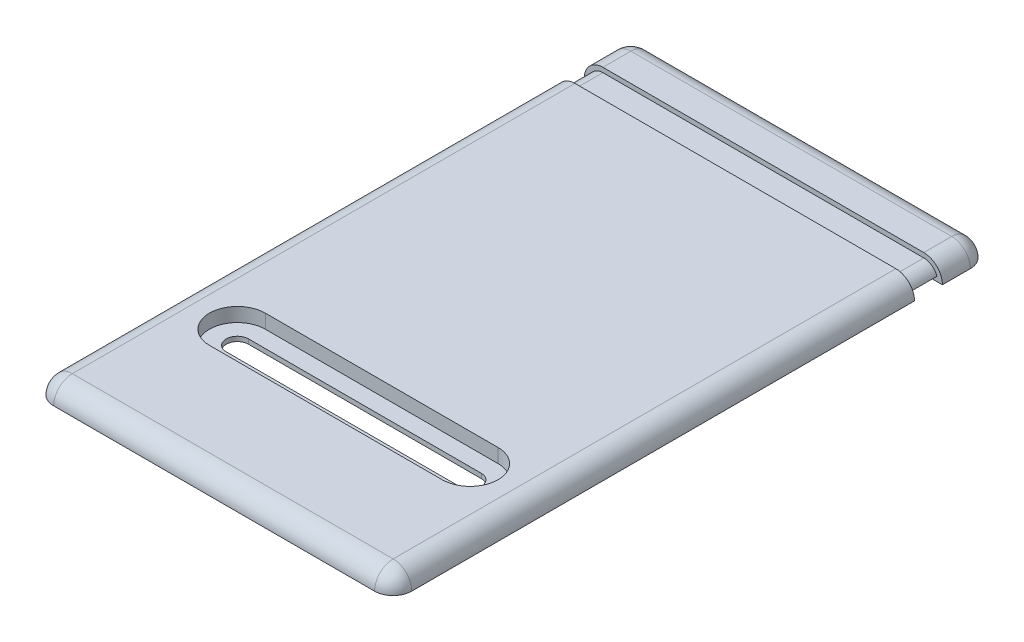
ISO-10303-21;
HEADER;
FILE_DESCRIPTION(('STEP AP214'),'2;1');
FILE_NAME('part.step','',(''),(''),'','','');
FILE_SCHEMA(('AUTOMOTIVE_DESIGN { 1 0 10303 214 1 1 1 1 }'));
ENDSEC;
DATA;
#1=APPLICATION_CONTEXT('core data for automotive mechanical design processes');
#2=APPLICATION_PROTOCOL_DEFINITION('international standard','automotive_design',2000,#1);
#3=PRODUCT_CONTEXT('',#1,'mechanical');
#4=PRODUCT('Part','Part','',(#3));
#5=PRODUCT_RELATED_PRODUCT_CATEGORY('part','',(#4));
#6=PRODUCT_DEFINITION_FORMATION('','',#4);
#7=PRODUCT_DEFINITION_CONTEXT('part definition',#1,'design');
#8=PRODUCT_DEFINITION('design','',#6,#7);
#9=PRODUCT_DEFINITION_SHAPE('','',#8);
#10=(LENGTH_UNIT() NAMED_UNIT(*) SI_UNIT(.MILLI.,.METRE.));
#11=(NAMED_UNIT(*) PLANE_ANGLE_UNIT() SI_UNIT($,.RADIAN.));
#12=(NAMED_UNIT(*) SI_UNIT($,.STERADIAN.) SOLID_ANGLE_UNIT());
#13=UNCERTAINTY_MEASURE_WITH_UNIT(LENGTH_MEASURE(1.E-05),#10,'distance_accuracy_value','');
#14=(GEOMETRIC_REPRESENTATION_CONTEXT(3) GLOBAL_UNCERTAINTY_ASSIGNED_CONTEXT((#13)) GLOBAL_UNIT_ASSIGNED_CONTEXT((#10,
#11,#12)) REPRESENTATION_CONTEXT('',''));
#15=CARTESIAN_POINT('',(0.,0.,0.));
#16=DIRECTION('',(0.,0.,1.));
#17=DIRECTION('',(1.,0.,0.));
#18=AXIS2_PLACEMENT_3D('',#15,#16,#17);
#19=CARTESIAN_POINT('',(0.,2.,0.));
#20=DIRECTION('',(0.,-1.,0.));
#21=DIRECTION('',(0.,0.,-1.));
#22=AXIS2_PLACEMENT_3D('',#19,#20,#21);
#23=PLANE('',#22);
#24=DIRECTION('',(1.,0.,0.));
#25=VECTOR('',#24,1.);
#26=CARTESIAN_POINT('',(-12.5,2.,20.));
#27=LINE('',#26,#25);
#28=CARTESIAN_POINT('',(-12.5,2.,20.));
#29=VERTEX_POINT('',#28);
#30=CARTESIAN_POINT('',(12.5,2.,20.));
#31=VERTEX_POINT('',#30);
#32=EDGE_CURVE('E291',#29,#31,#27,.T.);
#33=ORIENTED_EDGE('',*,*,#32,.F.);
#34=CARTESIAN_POINT('',(-12.5,2.,17.));
#35=DIRECTION('',(0.,1.,0.));
#36=DIRECTION('',(0.,0.,1.));
#37=AXIS2_PLACEMENT_3D('',#34,#35,#36);
#38=CIRCLE('',#37,3.);
#39=CARTESIAN_POINT('',(-12.5,2.,14.));
#40=VERTEX_POINT('',#39);
#41=EDGE_CURVE('E270',#40,#29,#38,.T.);
#42=ORIENTED_EDGE('',*,*,#41,.F.);
#43=DIRECTION('',(1.,0.,0.));
#44=VECTOR('',#43,1.);
#45=CARTESIAN_POINT('',(-12.5,2.,14.));
#46=LINE('',#45,#44);
#47=CARTESIAN_POINT('',(12.5,2.,14.));
#48=VERTEX_POINT('',#47);
#49=EDGE_CURVE('E281',#40,#48,#46,.T.);
#50=ORIENTED_EDGE('',*,*,#49,.T.);
#51=CARTESIAN_POINT('',(12.5,2.,17.));
#52=DIRECTION('',(0.,1.,0.));
#53=DIRECTION('',(0.,0.,1.));
#54=AXIS2_PLACEMENT_3D('',#51,#52,#53);
#55=CIRCLE('',#54,3.);
#56=EDGE_CURVE('E294',#31,#48,#55,.T.);
#57=ORIENTED_EDGE('',*,*,#56,.F.);
#58=EDGE_LOOP('',(#33,#42,#50,#57));
#59=FACE_BOUND('',#58,.T.);
#60=DIRECTION('',(0.,0.,-1.));
#61=VECTOR('',#60,1.);
#62=CARTESIAN_POINT('',(17.235,2.,0.));
#63=LINE('',#62,#61);
#64=CARTESIAN_POINT('',(17.235,2.,30.));
#65=VERTEX_POINT('',#64);
#66=CARTESIAN_POINT('',(17.235,2.,-24.));
#67=VERTEX_POINT('',#66);
#68=EDGE_CURVE('E329',#65,#67,#63,.T.);
#69=ORIENTED_EDGE('',*,*,#68,.T.);
#70=DIRECTION('',(-1.,0.,0.));
#71=VECTOR('',#70,1.);
#72=CARTESIAN_POINT('',(-17.235,2.,-24.));
#73=LINE('',#72,#71);
#74=CARTESIAN_POINT('',(-17.235,2.,-24.));
#75=VERTEX_POINT('',#74);
#76=EDGE_CURVE('E52',#67,#75,#73,.T.);
#77=ORIENTED_EDGE('',*,*,#76,.T.);
#78=DIRECTION('',(0.,0.,-1.));
#79=VECTOR('',#78,1.);
#80=CARTESIAN_POINT('',(-17.235,2.,32.));
#81=LINE('',#80,#79);
#82=CARTESIAN_POINT('',(-17.235,2.,30.));
#83=VERTEX_POINT('',#82);
#84=EDGE_CURVE('E322',#75,#83,#81,.F.);
#85=ORIENTED_EDGE('',*,*,#84,.T.);
#86=DIRECTION('',(1.,0.,0.));
#87=VECTOR('',#86,1.);
#88=CARTESIAN_POINT('',(0.,2.,30.));
#89=LINE('',#88,#87);
#90=EDGE_CURVE('E326',#83,#65,#89,.T.);
#91=ORIENTED_EDGE('',*,*,#90,.T.);
#92=EDGE_LOOP('',(#69,#77,#85,#91));
#93=FACE_BOUND('',#92,.T.);
#94=ADVANCED_FACE('F35',(#59,#93),#23,.F.);
#95=CARTESIAN_POINT('',(0.,0.,0.));
#96=DIRECTION('',(0.,-1.,0.));
#97=DIRECTION('',(0.,0.,-1.));
#98=AXIS2_PLACEMENT_3D('',#95,#96,#97);
#99=PLANE('',#98);
#100=DIRECTION('',(1.,0.,0.));
#101=VECTOR('',#100,1.);
#102=CARTESIAN_POINT('',(-19.235,0.,-24.));
#103=LINE('',#102,#101);
#104=CARTESIAN_POINT('',(-19.235,0.,-24.));
#105=VERTEX_POINT('',#104);
#106=CARTESIAN_POINT('',(19.235,0.,-24.));
#107=VERTEX_POINT('',#106);
#108=EDGE_CURVE('E232',#105,#107,#103,.T.);
#109=ORIENTED_EDGE('',*,*,#108,.T.);
#110=DIRECTION('',(0.,0.,-1.));
#111=VECTOR('',#110,1.);
#112=CARTESIAN_POINT('',(19.235,0.,32.));
#113=LINE('',#112,#111);
#114=CARTESIAN_POINT('',(19.235,0.,30.));
#115=VERTEX_POINT('',#114);
#116=EDGE_CURVE('E316',#115,#107,#113,.T.);
#117=ORIENTED_EDGE('',*,*,#116,.F.);
#118=CARTESIAN_POINT('',(17.235,0.,30.));
#119=DIRECTION('',(0.,-1.,0.));
#120=DIRECTION('',(0.,0.,-1.));
#121=AXIS2_PLACEMENT_3D('',#118,#119,#120);
#122=CIRCLE('',#121,2.);
#123=CARTESIAN_POINT('',(17.235,0.,32.));
#124=VERTEX_POINT('',#123);
#125=EDGE_CURVE('E335',#115,#124,#122,.T.);
#126=ORIENTED_EDGE('',*,*,#125,.T.);
#127=DIRECTION('',(1.,0.,0.));
#128=VECTOR('',#127,1.);
#129=CARTESIAN_POINT('',(-19.235,0.,32.));
#130=LINE('',#129,#128);
#131=CARTESIAN_POINT('',(-17.235,0.,32.));
#132=VERTEX_POINT('',#131);
#133=EDGE_CURVE('E319',#132,#124,#130,.T.);
#134=ORIENTED_EDGE('',*,*,#133,.F.);
#135=CARTESIAN_POINT('',(-17.235,0.,30.));
#136=DIRECTION('',(0.,-1.,0.));
#137=DIRECTION('',(0.,0.,-1.));
#138=AXIS2_PLACEMENT_3D('',#135,#136,#137);
#139=CIRCLE('',#138,2.);
#140=CARTESIAN_POINT('',(-19.235,0.,30.));
#141=VERTEX_POINT('',#140);
#142=EDGE_CURVE('E337',#132,#141,#139,.T.);
#143=ORIENTED_EDGE('',*,*,#142,.T.);
#144=DIRECTION('',(0.,0.,-1.));
#145=VECTOR('',#144,1.);
#146=CARTESIAN_POINT('',(-19.235,0.,32.));
#147=LINE('',#146,#145);
#148=EDGE_CURVE('E308',#141,#105,#147,.T.);
#149=ORIENTED_EDGE('',*,*,#148,.T.);
#150=EDGE_LOOP('',(#109,#117,#126,#134,#143,#149));
#151=FACE_BOUND('',#150,.T.);
#152=CARTESIAN_POINT('',(12.5,0.,17.));
#153=DIRECTION('',(0.,1.,0.));
#154=DIRECTION('',(0.,0.,1.));
#155=AXIS2_PLACEMENT_3D('',#152,#153,#154);
#156=CIRCLE('',#155,1.2);
#157=CARTESIAN_POINT('',(12.5,0.,18.2));
#158=VERTEX_POINT('',#157);
#159=CARTESIAN_POINT('',(12.5,0.,15.8));
#160=VERTEX_POINT('',#159);
#161=EDGE_CURVE('E245',#158,#160,#156,.T.);
#162=ORIENTED_EDGE('',*,*,#161,.T.);
#163=DIRECTION('',(-1.,0.,0.));
#164=VECTOR('',#163,1.);
#165=CARTESIAN_POINT('',(12.5,0.,15.8));
#166=LINE('',#165,#164);
#167=CARTESIAN_POINT('',(-12.5,0.,15.8));
#168=VERTEX_POINT('',#167);
#169=EDGE_CURVE('E248',#160,#168,#166,.T.);
#170=ORIENTED_EDGE('',*,*,#169,.T.);
#171=CARTESIAN_POINT('',(-12.5,0.,17.));
#172=DIRECTION('',(0.,1.,0.));
#173=DIRECTION('',(0.,0.,1.));
#174=AXIS2_PLACEMENT_3D('',#171,#172,#173);
#175=CIRCLE('',#174,1.2);
#176=CARTESIAN_POINT('',(-12.5,0.,18.2));
#177=VERTEX_POINT('',#176);
#178=EDGE_CURVE('E252',#168,#177,#175,.T.);
#179=ORIENTED_EDGE('',*,*,#178,.T.);
#180=DIRECTION('',(1.,0.,0.));
#181=VECTOR('',#180,1.);
#182=CARTESIAN_POINT('',(-12.5,0.,18.2));
#183=LINE('',#182,#181);
#184=EDGE_CURVE('E255',#177,#158,#183,.T.);
#185=ORIENTED_EDGE('',*,*,#184,.T.);
#186=EDGE_LOOP('',(#162,#170,#179,#185));
#187=FACE_BOUND('',#186,.T.);
#188=ADVANCED_FACE('F412',(#151,#187),#99,.T.);
#189=CARTESIAN_POINT('',(0.,0.,30.));
#190=DIRECTION('',(1.,0.,0.));
#191=DIRECTION('',(0.,0.,-1.));
#192=AXIS2_PLACEMENT_3D('',#189,#190,#191);
#193=CYLINDRICAL_SURFACE('',#192,2.);
#194=CARTESIAN_POINT('',(-17.235,0.,30.));
#195=DIRECTION('',(-1.,0.,0.));
#196=DIRECTION('',(0.,0.,1.));
#197=AXIS2_PLACEMENT_3D('',#194,#195,#196);
#198=CIRCLE('',#197,2.);
#199=EDGE_CURVE('E39',#132,#83,#198,.T.);
#200=ORIENTED_EDGE('',*,*,#199,.F.);
#201=ORIENTED_EDGE('',*,*,#133,.T.);
#202=CARTESIAN_POINT('',(17.235,0.,30.));
#203=DIRECTION('',(1.,0.,0.));
#204=DIRECTION('',(0.,0.,-1.));
#205=AXIS2_PLACEMENT_3D('',#202,#203,#204);
#206=CIRCLE('',#205,2.);
#207=EDGE_CURVE('E354',#65,#124,#206,.T.);
#208=ORIENTED_EDGE('',*,*,#207,.F.);
#209=ORIENTED_EDGE('',*,*,#90,.F.);
#210=EDGE_LOOP('',(#200,#201,#208,#209));
#211=FACE_BOUND('',#210,.T.);
#212=ADVANCED_FACE('F37',(#211),#193,.T.);
#213=CARTESIAN_POINT('',(-17.235,0.,30.));
#214=DIRECTION('',(0.,0.,1.));
#215=DIRECTION('',(1.,0.,0.));
#216=AXIS2_PLACEMENT_3D('',#213,#214,#215);
#217=SPHERICAL_SURFACE('',#216,2.);
#218=ORIENTED_EDGE('',*,*,#142,.F.);
#219=ORIENTED_EDGE('',*,*,#199,.T.);
#220=CARTESIAN_POINT('',(-17.235,0.,30.));
#221=DIRECTION('',(0.,0.,1.));
#222=DIRECTION('',(1.,0.,0.));
#223=AXIS2_PLACEMENT_3D('',#220,#221,#222);
#224=CIRCLE('',#223,2.);
#225=EDGE_CURVE('E352',#141,#83,#224,.F.);
#226=ORIENTED_EDGE('',*,*,#225,.F.);
#227=EDGE_LOOP('',(#218,#219,#226));
#228=FACE_BOUND('',#227,.T.);
#229=ADVANCED_FACE('F448',(#228),#217,.T.);
#230=CARTESIAN_POINT('',(17.235,0.,30.));
#231=DIRECTION('',(0.,0.,1.));
#232=DIRECTION('',(1.,0.,0.));
#233=AXIS2_PLACEMENT_3D('',#230,#231,#232);
#234=SPHERICAL_SURFACE('',#233,2.);
#235=ORIENTED_EDGE('',*,*,#207,.T.);
#236=ORIENTED_EDGE('',*,*,#125,.F.);
#237=CARTESIAN_POINT('',(17.235,0.,30.));
#238=DIRECTION('',(0.,0.,1.));
#239=DIRECTION('',(1.,0.,0.));
#240=AXIS2_PLACEMENT_3D('',#237,#238,#239);
#241=CIRCLE('',#240,2.);
#242=EDGE_CURVE('E349',#65,#115,#241,.F.);
#243=ORIENTED_EDGE('',*,*,#242,.F.);
#244=EDGE_LOOP('',(#235,#236,#243));
#245=FACE_BOUND('',#244,.T.);
#246=ADVANCED_FACE('F445',(#245),#234,.T.);
#247=CARTESIAN_POINT('',(-17.235,0.,32.));
#248=DIRECTION('',(0.,0.,1.));
#249=DIRECTION('',(1.,0.,0.));
#250=AXIS2_PLACEMENT_3D('',#247,#248,#249);
#251=CYLINDRICAL_SURFACE('',#250,2.);
#252=CARTESIAN_POINT('',(-17.235,0.,-24.));
#253=DIRECTION('',(0.,0.,1.));
#254=DIRECTION('',(1.,0.,0.));
#255=AXIS2_PLACEMENT_3D('',#252,#253,#254);
#256=CIRCLE('',#255,2.);
#257=EDGE_CURVE('E229',#75,#105,#256,.T.);
#258=ORIENTED_EDGE('',*,*,#257,.T.);
#259=ORIENTED_EDGE('',*,*,#148,.F.);
#260=ORIENTED_EDGE('',*,*,#225,.T.);
#261=ORIENTED_EDGE('',*,*,#84,.F.);
#262=EDGE_LOOP('',(#258,#259,#260,#261));
#263=FACE_BOUND('',#262,.T.);
#264=ADVANCED_FACE('F441',(#263),#251,.T.);
#265=CARTESIAN_POINT('',(17.235,0.,0.));
#266=DIRECTION('',(0.,0.,-1.));
#267=DIRECTION('',(-1.,0.,0.));
#268=AXIS2_PLACEMENT_3D('',#265,#266,#267);
#269=CYLINDRICAL_SURFACE('',#268,2.);
#270=CARTESIAN_POINT('',(17.235,0.,-24.));
#271=DIRECTION('',(0.,0.,1.));
#272=DIRECTION('',(1.,0.,0.));
#273=AXIS2_PLACEMENT_3D('',#270,#271,#272);
#274=CIRCLE('',#273,2.);
#275=EDGE_CURVE('E236',#107,#67,#274,.T.);
#276=ORIENTED_EDGE('',*,*,#275,.T.);
#277=ORIENTED_EDGE('',*,*,#68,.F.);
#278=ORIENTED_EDGE('',*,*,#242,.T.);
#279=ORIENTED_EDGE('',*,*,#116,.T.);
#280=EDGE_LOOP('',(#276,#277,#278,#279));
#281=FACE_BOUND('',#280,.T.);
#282=ADVANCED_FACE('F431',(#281),#269,.T.);
#283=CARTESIAN_POINT('',(-12.5,0.5,17.));
#284=DIRECTION('',(0.,1.,0.));
#285=DIRECTION('',(0.,0.,1.));
#286=AXIS2_PLACEMENT_3D('',#283,#284,#285);
#287=CYLINDRICAL_SURFACE('',#286,3.);
#288=ORIENTED_EDGE('',*,*,#41,.T.);
#289=DIRECTION('',(0.,1.,0.));
#290=VECTOR('',#289,1.);
#291=CARTESIAN_POINT('',(-12.5,0.5,20.));
#292=LINE('',#291,#290);
#293=CARTESIAN_POINT('',(-12.5,0.5,20.));
#294=VERTEX_POINT('',#293);
#295=EDGE_CURVE('E289',#294,#29,#292,.T.);
#296=ORIENTED_EDGE('',*,*,#295,.F.);
#297=CARTESIAN_POINT('',(-12.5,0.5,17.));
#298=DIRECTION('',(0.,1.,0.));
#299=DIRECTION('',(0.,0.,1.));
#300=AXIS2_PLACEMENT_3D('',#297,#298,#299);
#301=CIRCLE('',#300,3.);
#302=CARTESIAN_POINT('',(-12.5,0.5,14.));
#303=VERTEX_POINT('',#302);
#304=EDGE_CURVE('E277',#303,#294,#301,.T.);
#305=ORIENTED_EDGE('',*,*,#304,.F.);
#306=DIRECTION('',(0.,1.,0.));
#307=VECTOR('',#306,1.);
#308=CARTESIAN_POINT('',(-12.5,0.5,14.));
#309=LINE('',#308,#307);
#310=EDGE_CURVE('E299',#303,#40,#309,.T.);
#311=ORIENTED_EDGE('',*,*,#310,.T.);
#312=EDGE_LOOP('',(#288,#296,#305,#311));
#313=FACE_BOUND('',#312,.T.);
#314=ADVANCED_FACE('F440',(#313),#287,.F.);
#315=CARTESIAN_POINT('',(-12.5,0.5,14.));
#316=DIRECTION('',(0.,0.,1.));
#317=DIRECTION('',(1.,0.,0.));
#318=AXIS2_PLACEMENT_3D('',#315,#316,#317);
#319=PLANE('',#318);
#320=ORIENTED_EDGE('',*,*,#49,.F.);
#321=ORIENTED_EDGE('',*,*,#310,.F.);
#322=DIRECTION('',(1.,0.,0.));
#323=VECTOR('',#322,1.);
#324=CARTESIAN_POINT('',(-12.5,0.5,14.));
#325=LINE('',#324,#323);
#326=CARTESIAN_POINT('',(12.5,0.5,14.));
#327=VERTEX_POINT('',#326);
#328=EDGE_CURVE('E287',#303,#327,#325,.T.);
#329=ORIENTED_EDGE('',*,*,#328,.T.);
#330=DIRECTION('',(0.,1.,0.));
#331=VECTOR('',#330,1.);
#332=CARTESIAN_POINT('',(12.5,0.5,14.));
#333=LINE('',#332,#331);
#334=EDGE_CURVE('E302',#327,#48,#333,.T.);
#335=ORIENTED_EDGE('',*,*,#334,.T.);
#336=EDGE_LOOP('',(#320,#321,#329,#335));
#337=FACE_BOUND('',#336,.T.);
#338=ADVANCED_FACE('F486',(#337),#319,.T.);
#339=CARTESIAN_POINT('',(12.5,0.5,17.));
#340=DIRECTION('',(0.,1.,0.));
#341=DIRECTION('',(0.,0.,1.));
#342=AXIS2_PLACEMENT_3D('',#339,#340,#341);
#343=CYLINDRICAL_SURFACE('',#342,3.);
#344=ORIENTED_EDGE('',*,*,#56,.T.);
#345=ORIENTED_EDGE('',*,*,#334,.F.);
#346=CARTESIAN_POINT('',(12.5,0.5,17.));
#347=DIRECTION('',(0.,1.,0.));
#348=DIRECTION('',(0.,0.,1.));
#349=AXIS2_PLACEMENT_3D('',#346,#347,#348);
#350=CIRCLE('',#349,3.);
#351=CARTESIAN_POINT('',(12.5,0.5,20.));
#352=VERTEX_POINT('',#351);
#353=EDGE_CURVE('E284',#352,#327,#350,.T.);
#354=ORIENTED_EDGE('',*,*,#353,.F.);
#355=DIRECTION('',(0.,1.,0.));
#356=VECTOR('',#355,1.);
#357=CARTESIAN_POINT('',(12.5,0.5,20.));
#358=LINE('',#357,#356);
#359=EDGE_CURVE('E304',#352,#31,#358,.T.);
#360=ORIENTED_EDGE('',*,*,#359,.T.);
#361=EDGE_LOOP('',(#344,#345,#354,#360));
#362=FACE_BOUND('',#361,.T.);
#363=ADVANCED_FACE('F489',(#362),#343,.F.);
#364=CARTESIAN_POINT('',(-12.5,0.5,20.));
#365=DIRECTION('',(0.,0.,1.));
#366=DIRECTION('',(1.,0.,0.));
#367=AXIS2_PLACEMENT_3D('',#364,#365,#366);
#368=PLANE('',#367);
#369=ORIENTED_EDGE('',*,*,#32,.T.);
#370=ORIENTED_EDGE('',*,*,#359,.F.);
#371=DIRECTION('',(1.,0.,0.));
#372=VECTOR('',#371,1.);
#373=CARTESIAN_POINT('',(-12.5,0.5,20.));
#374=LINE('',#373,#372);
#375=EDGE_CURVE('E280',#294,#352,#374,.T.);
#376=ORIENTED_EDGE('',*,*,#375,.F.);
#377=ORIENTED_EDGE('',*,*,#295,.T.);
#378=EDGE_LOOP('',(#369,#370,#376,#377));
#379=FACE_BOUND('',#378,.T.);
#380=ADVANCED_FACE('F484',(#379),#368,.F.);
#381=CARTESIAN_POINT('',(-12.5,0.5,17.));
#382=DIRECTION('',(0.,1.,0.));
#383=DIRECTION('',(0.,0.,1.));
#384=AXIS2_PLACEMENT_3D('',#381,#382,#383);
#385=PLANE('',#384);
#386=CARTESIAN_POINT('',(12.5,0.5,17.));
#387=DIRECTION('',(0.,1.,0.));
#388=DIRECTION('',(0.,0.,1.));
#389=AXIS2_PLACEMENT_3D('',#386,#387,#388);
#390=CIRCLE('',#389,1.2);
#391=CARTESIAN_POINT('',(12.5,0.5,18.2));
#392=VERTEX_POINT('',#391);
#393=CARTESIAN_POINT('',(12.5,0.5,15.8));
#394=VERTEX_POINT('',#393);
#395=EDGE_CURVE('E239',#392,#394,#390,.T.);
#396=ORIENTED_EDGE('',*,*,#395,.F.);
#397=DIRECTION('',(1.,0.,0.));
#398=VECTOR('',#397,1.);
#399=CARTESIAN_POINT('',(-12.5,0.5,18.2));
#400=LINE('',#399,#398);
#401=CARTESIAN_POINT('',(-12.5,0.5,18.2));
#402=VERTEX_POINT('',#401);
#403=EDGE_CURVE('E249',#402,#392,#400,.T.);
#404=ORIENTED_EDGE('',*,*,#403,.F.);
#405=CARTESIAN_POINT('',(-12.5,0.5,17.));
#406=DIRECTION('',(0.,1.,0.));
#407=DIRECTION('',(0.,0.,1.));
#408=AXIS2_PLACEMENT_3D('',#405,#406,#407);
#409=CIRCLE('',#408,1.2);
#410=CARTESIAN_POINT('',(-12.5,0.5,15.8));
#411=VERTEX_POINT('',#410);
#412=EDGE_CURVE('E263',#411,#402,#409,.T.);
#413=ORIENTED_EDGE('',*,*,#412,.F.);
#414=DIRECTION('',(-1.,0.,0.));
#415=VECTOR('',#414,1.);
#416=CARTESIAN_POINT('',(12.5,0.5,15.8));
#417=LINE('',#416,#415);
#418=EDGE_CURVE('E260',#394,#411,#417,.T.);
#419=ORIENTED_EDGE('',*,*,#418,.F.);
#420=EDGE_LOOP('',(#396,#404,#413,#419));
#421=FACE_BOUND('',#420,.T.);
#422=ORIENTED_EDGE('',*,*,#304,.T.);
#423=ORIENTED_EDGE('',*,*,#375,.T.);
#424=ORIENTED_EDGE('',*,*,#353,.T.);
#425=ORIENTED_EDGE('',*,*,#328,.F.);
#426=EDGE_LOOP('',(#422,#423,#424,#425));
#427=FACE_BOUND('',#426,.T.);
#428=ADVANCED_FACE('F480',(#421,#427),#385,.T.);
#429=CARTESIAN_POINT('',(12.5,0.,17.));
#430=DIRECTION('',(0.,1.,0.));
#431=DIRECTION('',(0.,0.,1.));
#432=AXIS2_PLACEMENT_3D('',#429,#430,#431);
#433=CYLINDRICAL_SURFACE('',#432,1.2);
#434=ORIENTED_EDGE('',*,*,#395,.T.);
#435=DIRECTION('',(0.,1.,0.));
#436=VECTOR('',#435,1.);
#437=CARTESIAN_POINT('',(12.5,0.,15.8));
#438=LINE('',#437,#436);
#439=EDGE_CURVE('E258',#160,#394,#438,.T.);
#440=ORIENTED_EDGE('',*,*,#439,.F.);
#441=ORIENTED_EDGE('',*,*,#161,.F.);
#442=DIRECTION('',(0.,1.,0.));
#443=VECTOR('',#442,1.);
#444=CARTESIAN_POINT('',(12.5,0.,18.2));
#445=LINE('',#444,#443);
#446=EDGE_CURVE('E268',#158,#392,#445,.T.);
#447=ORIENTED_EDGE('',*,*,#446,.T.);
#448=EDGE_LOOP('',(#434,#440,#441,#447));
#449=FACE_BOUND('',#448,.T.);
#450=ADVANCED_FACE('F473',(#449),#433,.F.);
#451=CARTESIAN_POINT('',(-12.5,0.,18.2));
#452=DIRECTION('',(0.,0.,1.));
#453=DIRECTION('',(1.,0.,0.));
#454=AXIS2_PLACEMENT_3D('',#451,#452,#453);
#455=PLANE('',#454);
#456=ORIENTED_EDGE('',*,*,#403,.T.);
#457=ORIENTED_EDGE('',*,*,#446,.F.);
#458=ORIENTED_EDGE('',*,*,#184,.F.);
#459=DIRECTION('',(0.,1.,0.));
#460=VECTOR('',#459,1.);
#461=CARTESIAN_POINT('',(-12.5,0.,18.2));
#462=LINE('',#461,#460);
#463=EDGE_CURVE('E271',#177,#402,#462,.T.);
#464=ORIENTED_EDGE('',*,*,#463,.T.);
#465=EDGE_LOOP('',(#456,#457,#458,#464));
#466=FACE_BOUND('',#465,.T.);
#467=ADVANCED_FACE('F470',(#466),#455,.F.);
#468=CARTESIAN_POINT('',(-12.5,0.,17.));
#469=DIRECTION('',(0.,1.,0.));
#470=DIRECTION('',(0.,0.,1.));
#471=AXIS2_PLACEMENT_3D('',#468,#469,#470);
#472=CYLINDRICAL_SURFACE('',#471,1.2);
#473=ORIENTED_EDGE('',*,*,#412,.T.);
#474=ORIENTED_EDGE('',*,*,#463,.F.);
#475=ORIENTED_EDGE('',*,*,#178,.F.);
#476=DIRECTION('',(0.,1.,0.));
#477=VECTOR('',#476,1.);
#478=CARTESIAN_POINT('',(-12.5,0.,15.8));
#479=LINE('',#478,#477);
#480=EDGE_CURVE('E273',#168,#411,#479,.T.);
#481=ORIENTED_EDGE('',*,*,#480,.T.);
#482=EDGE_LOOP('',(#473,#474,#475,#481));
#483=FACE_BOUND('',#482,.T.);
#484=ADVANCED_FACE('F465',(#483),#472,.F.);
#485=CARTESIAN_POINT('',(12.5,0.,15.8));
#486=DIRECTION('',(0.,0.,-1.));
#487=DIRECTION('',(-1.,0.,0.));
#488=AXIS2_PLACEMENT_3D('',#485,#486,#487);
#489=PLANE('',#488);
#490=ORIENTED_EDGE('',*,*,#418,.T.);
#491=ORIENTED_EDGE('',*,*,#480,.F.);
#492=ORIENTED_EDGE('',*,*,#169,.F.);
#493=ORIENTED_EDGE('',*,*,#439,.T.);
#494=EDGE_LOOP('',(#490,#491,#492,#493));
#495=FACE_BOUND('',#494,.T.);
#496=ADVANCED_FACE('F460',(#495),#489,.F.);
#497=CARTESIAN_POINT('',(-17.235,0.,-24.));
#498=DIRECTION('',(0.,0.,1.));
#499=DIRECTION('',(1.,0.,0.));
#500=AXIS2_PLACEMENT_3D('',#497,#498,#499);
#501=PLANE('',#500);
#502=ORIENTED_EDGE('',*,*,#257,.F.);
#503=ORIENTED_EDGE('',*,*,#76,.F.);
#504=ORIENTED_EDGE('',*,*,#275,.F.);
#505=ORIENTED_EDGE('',*,*,#108,.F.);
#506=EDGE_LOOP('',(#502,#503,#504,#505));
#507=FACE_BOUND('',#506,.T.);
#508=DIRECTION('',(1.,0.,0.));
#509=VECTOR('',#508,1.);
#510=CARTESIAN_POINT('',(-18.6492135623731,0.5,-24.));
#511=LINE('',#510,#509);
#512=CARTESIAN_POINT('',(-18.6492135623731,0.5,-24.));
#513=VERTEX_POINT('',#512);
#514=CARTESIAN_POINT('',(18.6492135623731,0.5,-24.));
#515=VERTEX_POINT('',#514);
#516=EDGE_CURVE('E190',#513,#515,#511,.T.);
#517=ORIENTED_EDGE('',*,*,#516,.T.);
#518=CARTESIAN_POINT('',(17.235,0.,-24.));
#519=DIRECTION('',(0.,0.,1.));
#520=DIRECTION('',(1.,0.,0.));
#521=AXIS2_PLACEMENT_3D('',#518,#519,#520);
#522=CIRCLE('',#521,1.5);
#523=CARTESIAN_POINT('',(17.235,1.5,-24.));
#524=VERTEX_POINT('',#523);
#525=EDGE_CURVE('E211',#515,#524,#522,.T.);
#526=ORIENTED_EDGE('',*,*,#525,.T.);
#527=DIRECTION('',(-1.,0.,0.));
#528=VECTOR('',#527,1.);
#529=CARTESIAN_POINT('',(-17.235,1.5,-24.));
#530=LINE('',#529,#528);
#531=CARTESIAN_POINT('',(-17.235,1.5,-24.));
#532=VERTEX_POINT('',#531);
#533=EDGE_CURVE('E193',#524,#532,#530,.T.);
#534=ORIENTED_EDGE('',*,*,#533,.T.);
#535=CARTESIAN_POINT('',(-17.235,0.,-24.));
#536=DIRECTION('',(0.,0.,1.));
#537=DIRECTION('',(1.,0.,0.));
#538=AXIS2_PLACEMENT_3D('',#535,#536,#537);
#539=CIRCLE('',#538,1.5);
#540=EDGE_CURVE('E185',#532,#513,#539,.T.);
#541=ORIENTED_EDGE('',*,*,#540,.T.);
#542=EDGE_LOOP('',(#517,#526,#534,#541));
#543=FACE_BOUND('',#542,.T.);
#544=ADVANCED_FACE('F187',(#507,#543),#501,.F.);
#545=CARTESIAN_POINT('',(-17.235,0.,-27.));
#546=DIRECTION('',(0.,0.,1.));
#547=DIRECTION('',(1.,0.,0.));
#548=AXIS2_PLACEMENT_3D('',#545,#546,#547);
#549=PLANE('',#548);
#550=CARTESIAN_POINT('',(-17.235,0.,-27.));
#551=DIRECTION('',(0.,0.,1.));
#552=DIRECTION('',(1.,0.,0.));
#553=AXIS2_PLACEMENT_3D('',#550,#551,#552);
#554=CIRCLE('',#553,2.);
#555=CARTESIAN_POINT('',(-17.235,2.,-27.));
#556=VERTEX_POINT('',#555);
#557=CARTESIAN_POINT('',(-19.235,0.,-27.));
#558=VERTEX_POINT('',#557);
#559=EDGE_CURVE('E206',#556,#558,#554,.T.);
#560=ORIENTED_EDGE('',*,*,#559,.T.);
#561=DIRECTION('',(1.,0.,0.));
#562=VECTOR('',#561,1.);
#563=CARTESIAN_POINT('',(-19.235,0.,-27.));
#564=LINE('',#563,#562);
#565=CARTESIAN_POINT('',(19.235,0.,-27.));
#566=VERTEX_POINT('',#565);
#567=EDGE_CURVE('E60',#558,#566,#564,.T.);
#568=ORIENTED_EDGE('',*,*,#567,.T.);
#569=CARTESIAN_POINT('',(17.235,0.,-27.));
#570=DIRECTION('',(0.,0.,1.));
#571=DIRECTION('',(1.,0.,0.));
#572=AXIS2_PLACEMENT_3D('',#569,#570,#571);
#573=CIRCLE('',#572,2.);
#574=CARTESIAN_POINT('',(17.235,2.,-27.));
#575=VERTEX_POINT('',#574);
#576=EDGE_CURVE('E242',#566,#575,#573,.T.);
#577=ORIENTED_EDGE('',*,*,#576,.T.);
#578=DIRECTION('',(-1.,0.,0.));
#579=VECTOR('',#578,1.);
#580=CARTESIAN_POINT('',(-17.235,2.,-27.));
#581=LINE('',#580,#579);
#582=EDGE_CURVE('E233',#575,#556,#581,.T.);
#583=ORIENTED_EDGE('',*,*,#582,.T.);
#584=EDGE_LOOP('',(#560,#568,#577,#583));
#585=FACE_BOUND('',#584,.T.);
#586=CARTESIAN_POINT('',(-17.235,0.,-27.));
#587=DIRECTION('',(0.,0.,1.));
#588=DIRECTION('',(1.,0.,0.));
#589=AXIS2_PLACEMENT_3D('',#586,#587,#588);
#590=CIRCLE('',#589,1.5);
#591=CARTESIAN_POINT('',(-17.235,1.5,-27.));
#592=VERTEX_POINT('',#591);
#593=CARTESIAN_POINT('',(-18.6492135623731,0.5,-27.));
#594=VERTEX_POINT('',#593);
#595=EDGE_CURVE('E203',#592,#594,#590,.T.);
#596=ORIENTED_EDGE('',*,*,#595,.F.);
#597=DIRECTION('',(-1.,0.,0.));
#598=VECTOR('',#597,1.);
#599=CARTESIAN_POINT('',(-17.235,1.5,-27.));
#600=LINE('',#599,#598);
#601=CARTESIAN_POINT('',(17.235,1.5,-27.));
#602=VERTEX_POINT('',#601);
#603=EDGE_CURVE('E197',#602,#592,#600,.T.);
#604=ORIENTED_EDGE('',*,*,#603,.F.);
#605=CARTESIAN_POINT('',(17.235,0.,-27.));
#606=DIRECTION('',(0.,0.,1.));
#607=DIRECTION('',(1.,0.,0.));
#608=AXIS2_PLACEMENT_3D('',#605,#606,#607);
#609=CIRCLE('',#608,1.5);
#610=CARTESIAN_POINT('',(18.6492135623731,0.5,-27.));
#611=VERTEX_POINT('',#610);
#612=EDGE_CURVE('E220',#611,#602,#609,.T.);
#613=ORIENTED_EDGE('',*,*,#612,.F.);
#614=DIRECTION('',(1.,0.,0.));
#615=VECTOR('',#614,1.);
#616=CARTESIAN_POINT('',(-18.6492135623731,0.5,-27.));
#617=LINE('',#616,#615);
#618=EDGE_CURVE('E218',#594,#611,#617,.T.);
#619=ORIENTED_EDGE('',*,*,#618,.F.);
#620=EDGE_LOOP('',(#596,#604,#613,#619));
#621=FACE_BOUND('',#620,.T.);
#622=ADVANCED_FACE('F393',(#585,#621),#549,.T.);
#623=CARTESIAN_POINT('',(-17.235,0.,-24.));
#624=DIRECTION('',(0.,0.,-1.));
#625=DIRECTION('',(-1.,0.,0.));
#626=AXIS2_PLACEMENT_3D('',#623,#624,#625);
#627=CYLINDRICAL_SURFACE('',#626,1.5);
#628=ORIENTED_EDGE('',*,*,#595,.T.);
#629=DIRECTION('',(0.,0.,-1.));
#630=VECTOR('',#629,1.);
#631=CARTESIAN_POINT('',(-18.6492135623731,0.5,-24.));
#632=LINE('',#631,#630);
#633=EDGE_CURVE('E201',#513,#594,#632,.T.);
#634=ORIENTED_EDGE('',*,*,#633,.F.);
#635=ORIENTED_EDGE('',*,*,#540,.F.);
#636=DIRECTION('',(0.,0.,-1.));
#637=VECTOR('',#636,1.);
#638=CARTESIAN_POINT('',(-17.235,1.5,-24.));
#639=LINE('',#638,#637);
#640=EDGE_CURVE('E216',#532,#592,#639,.T.);
#641=ORIENTED_EDGE('',*,*,#640,.T.);
#642=EDGE_LOOP('',(#628,#634,#635,#641));
#643=FACE_BOUND('',#642,.T.);
#644=ADVANCED_FACE('F202',(#643),#627,.T.);
#645=CARTESIAN_POINT('',(-18.6492135623731,0.5,-24.));
#646=DIRECTION('',(0.,1.,0.));
#647=DIRECTION('',(0.,0.,1.));
#648=AXIS2_PLACEMENT_3D('',#645,#646,#647);
#649=PLANE('',#648);
#650=ORIENTED_EDGE('',*,*,#618,.T.);
#651=DIRECTION('',(0.,0.,-1.));
#652=VECTOR('',#651,1.);
#653=CARTESIAN_POINT('',(18.6492135623731,0.5,-24.));
#654=LINE('',#653,#652);
#655=EDGE_CURVE('E207',#515,#611,#654,.T.);
#656=ORIENTED_EDGE('',*,*,#655,.F.);
#657=ORIENTED_EDGE('',*,*,#516,.F.);
#658=ORIENTED_EDGE('',*,*,#633,.T.);
#659=EDGE_LOOP('',(#650,#656,#657,#658));
#660=FACE_BOUND('',#659,.T.);
#661=ADVANCED_FACE('F209',(#660),#649,.F.);
#662=CARTESIAN_POINT('',(17.235,0.,-24.));
#663=DIRECTION('',(0.,0.,-1.));
#664=DIRECTION('',(-1.,0.,0.));
#665=AXIS2_PLACEMENT_3D('',#662,#663,#664);
#666=CYLINDRICAL_SURFACE('',#665,1.5);
#667=ORIENTED_EDGE('',*,*,#612,.T.);
#668=DIRECTION('',(0.,0.,-1.));
#669=VECTOR('',#668,1.);
#670=CARTESIAN_POINT('',(17.235,1.5,-24.));
#671=LINE('',#670,#669);
#672=EDGE_CURVE('E226',#524,#602,#671,.T.);
#673=ORIENTED_EDGE('',*,*,#672,.F.);
#674=ORIENTED_EDGE('',*,*,#525,.F.);
#675=ORIENTED_EDGE('',*,*,#655,.T.);
#676=EDGE_LOOP('',(#667,#673,#674,#675));
#677=FACE_BOUND('',#676,.T.);
#678=ADVANCED_FACE('F402',(#677),#666,.T.);
#679=CARTESIAN_POINT('',(-17.235,1.5,-24.));
#680=DIRECTION('',(0.,-1.,0.));
#681=DIRECTION('',(0.,0.,-1.));
#682=AXIS2_PLACEMENT_3D('',#679,#680,#681);
#683=PLANE('',#682);
#684=ORIENTED_EDGE('',*,*,#603,.T.);
#685=ORIENTED_EDGE('',*,*,#640,.F.);
#686=ORIENTED_EDGE('',*,*,#533,.F.);
#687=ORIENTED_EDGE('',*,*,#672,.T.);
#688=EDGE_LOOP('',(#684,#685,#686,#687));
#689=FACE_BOUND('',#688,.T.);
#690=ADVANCED_FACE('F400',(#689),#683,.F.);
#691=CARTESIAN_POINT('',(-19.235,0.,-30.));
#692=DIRECTION('',(-1.,0.,0.));
#693=DIRECTION('',(0.,0.,1.));
#694=AXIS2_PLACEMENT_3D('',#691,#692,#693);
#695=CYLINDRICAL_SURFACE('',#694,2.);
#696=CARTESIAN_POINT('',(-17.235,0.,-30.));
#697=DIRECTION('',(-1.,0.,0.));
#698=DIRECTION('',(0.,0.,1.));
#699=AXIS2_PLACEMENT_3D('',#696,#697,#698);
#700=CIRCLE('',#699,2.);
#701=CARTESIAN_POINT('',(-17.235,0.,-32.));
#702=VERTEX_POINT('',#701);
#703=CARTESIAN_POINT('',(-17.235,2.,-30.));
#704=VERTEX_POINT('',#703);
#705=EDGE_CURVE('E341',#702,#704,#700,.F.);
#706=ORIENTED_EDGE('',*,*,#705,.T.);
#707=DIRECTION('',(1.,0.,0.));
#708=VECTOR('',#707,1.);
#709=CARTESIAN_POINT('',(-19.235,2.,-30.));
#710=LINE('',#709,#708);
#711=CARTESIAN_POINT('',(17.235,2.,-30.));
#712=VERTEX_POINT('',#711);
#713=EDGE_CURVE('E332',#712,#704,#710,.F.);
#714=ORIENTED_EDGE('',*,*,#713,.F.);
#715=CARTESIAN_POINT('',(17.235,0.,-30.));
#716=DIRECTION('',(1.,0.,0.));
#717=DIRECTION('',(0.,1.,0.));
#718=AXIS2_PLACEMENT_3D('',#715,#716,#717);
#719=CIRCLE('',#718,2.);
#720=CARTESIAN_POINT('',(17.235,0.,-32.));
#721=VERTEX_POINT('',#720);
#722=EDGE_CURVE('E301',#712,#721,#719,.F.);
#723=ORIENTED_EDGE('',*,*,#722,.T.);
#724=DIRECTION('',(1.,0.,0.));
#725=VECTOR('',#724,1.);
#726=CARTESIAN_POINT('',(-19.235,0.,-32.));
#727=LINE('',#726,#725);
#728=EDGE_CURVE('E311',#702,#721,#727,.T.);
#729=ORIENTED_EDGE('',*,*,#728,.F.);
#730=EDGE_LOOP('',(#706,#714,#723,#729));
#731=FACE_BOUND('',#730,.T.);
#732=ADVANCED_FACE('F381',(#731),#695,.T.);
#733=CARTESIAN_POINT('',(-17.235,0.,-30.));
#734=DIRECTION('',(0.,0.,1.));
#735=DIRECTION('',(1.,0.,0.));
#736=AXIS2_PLACEMENT_3D('',#733,#734,#735);
#737=SPHERICAL_SURFACE('',#736,2.);
#738=CARTESIAN_POINT('',(-17.235,0.,-30.));
#739=DIRECTION('',(0.,-1.,0.));
#740=DIRECTION('',(0.,0.,-1.));
#741=AXIS2_PLACEMENT_3D('',#738,#739,#740);
#742=CIRCLE('',#741,2.);
#743=CARTESIAN_POINT('',(-19.235,0.,-30.));
#744=VERTEX_POINT('',#743);
#745=EDGE_CURVE('E44',#744,#702,#742,.T.);
#746=ORIENTED_EDGE('',*,*,#745,.F.);
#747=CARTESIAN_POINT('',(-17.235,0.,-30.));
#748=DIRECTION('',(0.,0.,-1.));
#749=DIRECTION('',(-1.,0.,0.));
#750=AXIS2_PLACEMENT_3D('',#747,#748,#749);
#751=CIRCLE('',#750,2.);
#752=EDGE_CURVE('E346',#744,#704,#751,.T.);
#753=ORIENTED_EDGE('',*,*,#752,.T.);
#754=ORIENTED_EDGE('',*,*,#705,.F.);
#755=EDGE_LOOP('',(#746,#753,#754));
#756=FACE_BOUND('',#755,.T.);
#757=ADVANCED_FACE('F377',(#756),#737,.T.);
#758=CARTESIAN_POINT('',(17.235,0.,-30.));
#759=DIRECTION('',(0.,0.,1.));
#760=DIRECTION('',(1.,0.,0.));
#761=AXIS2_PLACEMENT_3D('',#758,#759,#760);
#762=SPHERICAL_SURFACE('',#761,2.);
#763=CARTESIAN_POINT('',(17.235,0.,-30.));
#764=DIRECTION('',(0.,0.,-1.));
#765=DIRECTION('',(-1.,0.,0.));
#766=AXIS2_PLACEMENT_3D('',#763,#764,#765);
#767=CIRCLE('',#766,2.);
#768=CARTESIAN_POINT('',(19.235,0.,-30.));
#769=VERTEX_POINT('',#768);
#770=EDGE_CURVE('E343',#712,#769,#767,.T.);
#771=ORIENTED_EDGE('',*,*,#770,.T.);
#772=CARTESIAN_POINT('',(17.235,0.,-30.));
#773=DIRECTION('',(0.,-1.,0.));
#774=DIRECTION('',(0.,0.,-1.));
#775=AXIS2_PLACEMENT_3D('',#772,#773,#774);
#776=CIRCLE('',#775,2.);
#777=EDGE_CURVE('E11',#721,#769,#776,.T.);
#778=ORIENTED_EDGE('',*,*,#777,.F.);
#779=ORIENTED_EDGE('',*,*,#722,.F.);
#780=EDGE_LOOP('',(#771,#778,#779));
#781=FACE_BOUND('',#780,.T.);
#782=ADVANCED_FACE('F386',(#781),#762,.T.);
#783=EDGE_CURVE('E312',#558,#744,#147,.T.);
#784=ORIENTED_EDGE('',*,*,#783,.F.);
#785=ORIENTED_EDGE('',*,*,#559,.F.);
#786=EDGE_CURVE('E323',#704,#556,#81,.F.);
#787=ORIENTED_EDGE('',*,*,#786,.F.);
#788=ORIENTED_EDGE('',*,*,#752,.F.);
#789=EDGE_LOOP('',(#784,#785,#787,#788));
#790=FACE_BOUND('',#789,.T.);
#791=ADVANCED_FACE('F375',(#790),#251,.T.);
#792=EDGE_CURVE('E328',#575,#712,#63,.T.);
#793=ORIENTED_EDGE('',*,*,#792,.F.);
#794=ORIENTED_EDGE('',*,*,#576,.F.);
#795=EDGE_CURVE('E315',#566,#769,#113,.T.);
#796=ORIENTED_EDGE('',*,*,#795,.T.);
#797=ORIENTED_EDGE('',*,*,#770,.F.);
#798=EDGE_LOOP('',(#793,#794,#796,#797));
#799=FACE_BOUND('',#798,.T.);
#800=ADVANCED_FACE('F389',(#799),#269,.T.);
#801=ORIENTED_EDGE('',*,*,#795,.F.);
#802=ORIENTED_EDGE('',*,*,#567,.F.);
#803=ORIENTED_EDGE('',*,*,#783,.T.);
#804=ORIENTED_EDGE('',*,*,#745,.T.);
#805=ORIENTED_EDGE('',*,*,#728,.T.);
#806=ORIENTED_EDGE('',*,*,#777,.T.);
#807=EDGE_LOOP('',(#801,#802,#803,#804,#805,#806));
#808=FACE_BOUND('',#807,.T.);
#809=ADVANCED_FACE('F369',(#808),#99,.T.);
#810=ORIENTED_EDGE('',*,*,#582,.F.);
#811=ORIENTED_EDGE('',*,*,#792,.T.);
#812=ORIENTED_EDGE('',*,*,#713,.T.);
#813=ORIENTED_EDGE('',*,*,#786,.T.);
#814=EDGE_LOOP('',(#810,#811,#812,#813));
#815=FACE_BOUND('',#814,.T.);
#816=ADVANCED_FACE('F392',(#815),#23,.F.);
#817=CLOSED_SHELL('',(#94,#188,#212,#229,#246,#264,#282,#314,#338,#363,#380,#428,#450,#467,#484,
#496,#544,#622,#644,#661,#678,#690,#732,#757,#782,#791,#800,#809,#816));
#818=MANIFOLD_SOLID_BREP('B2',#817);
#819=ADVANCED_BREP_SHAPE_REPRESENTATION('',(#18,#818),#14);
#820=SHAPE_DEFINITION_REPRESENTATION(#9,#819);
ENDSEC;
END-ISO-10303-21;
